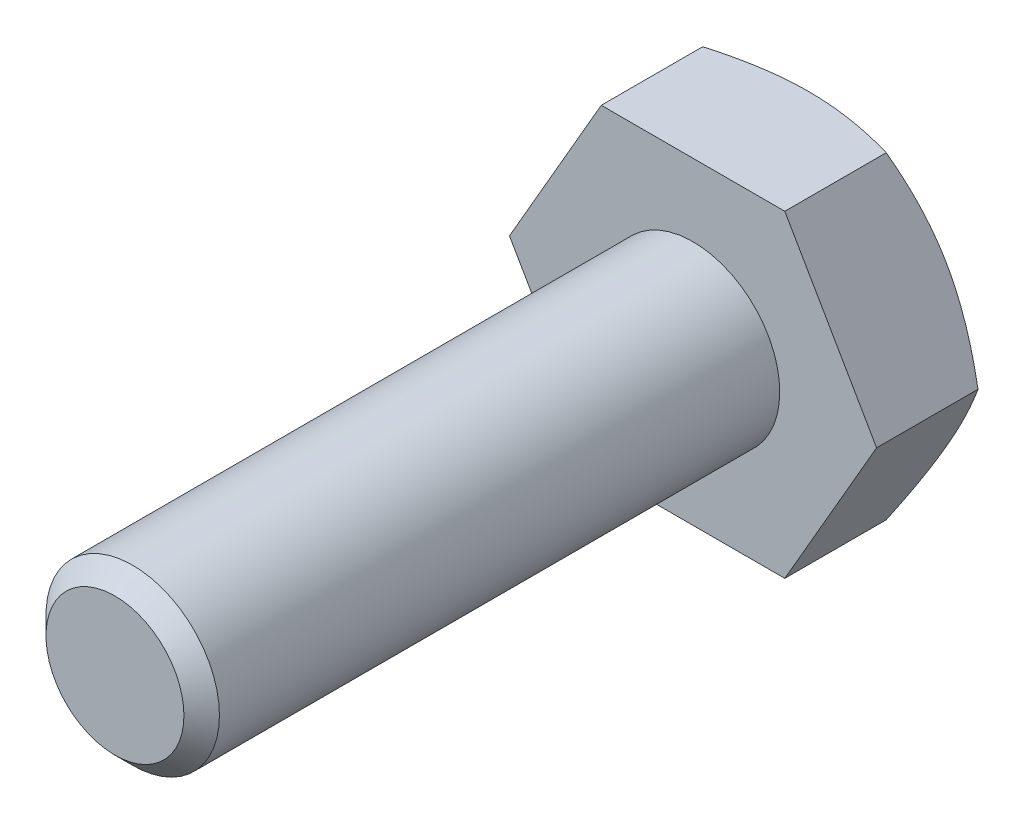
ISO-10303-21;
HEADER;
FILE_DESCRIPTION(('STEP AP214'),'2;1');
FILE_NAME('part.step','',(''),(''),'','','');
FILE_SCHEMA(('AUTOMOTIVE_DESIGN { 1 0 10303 214 1 1 1 1 }'));
ENDSEC;
DATA;
#1=APPLICATION_CONTEXT('core data for automotive mechanical design processes');
#2=APPLICATION_PROTOCOL_DEFINITION('international standard','automotive_design',2000,#1);
#3=PRODUCT_CONTEXT('',#1,'mechanical');
#4=PRODUCT('Part','Part','',(#3));
#5=PRODUCT_RELATED_PRODUCT_CATEGORY('part','',(#4));
#6=PRODUCT_DEFINITION_FORMATION('','',#4);
#7=PRODUCT_DEFINITION_CONTEXT('part definition',#1,'design');
#8=PRODUCT_DEFINITION('design','',#6,#7);
#9=PRODUCT_DEFINITION_SHAPE('','',#8);
#10=(LENGTH_UNIT() NAMED_UNIT(*) SI_UNIT(.MILLI.,.METRE.));
#11=(NAMED_UNIT(*) PLANE_ANGLE_UNIT() SI_UNIT($,.RADIAN.));
#12=(NAMED_UNIT(*) SI_UNIT($,.STERADIAN.) SOLID_ANGLE_UNIT());
#13=UNCERTAINTY_MEASURE_WITH_UNIT(LENGTH_MEASURE(1.E-05),#10,'distance_accuracy_value','');
#14=(GEOMETRIC_REPRESENTATION_CONTEXT(3) GLOBAL_UNCERTAINTY_ASSIGNED_CONTEXT((#13)) GLOBAL_UNIT_ASSIGNED_CONTEXT((#10,
#11,#12)) REPRESENTATION_CONTEXT('',''));
#15=CARTESIAN_POINT('',(0.,0.,0.));
#16=DIRECTION('',(0.,0.,1.));
#17=DIRECTION('',(1.,0.,0.));
#18=AXIS2_PLACEMENT_3D('',#15,#16,#17);
#19=CARTESIAN_POINT('',(1.58771324027147,-2.75,2.));
#20=DIRECTION('',(-0.866025403784439,0.5,0.));
#21=DIRECTION('',(-0.5,-0.866025403784439,0.));
#22=AXIS2_PLACEMENT_3D('',#19,#20,#21);
#23=PLANE('',#22);
#24=CARTESIAN_POINT('',(3.17554195059678,0.000200000000001707,0.245686763364756));
#25=CARTESIAN_POINT('',(3.10576962051743,-0.120649220659903,0.205387662249254));
#26=CARTESIAN_POINT('',(3.03539502097908,-0.24254160262263,0.168736902597655));
#27=CARTESIAN_POINT('',(2.89342717394439,-0.488437126727888,0.104762182969802));
#28=CARTESIAN_POINT('',(2.82183140359859,-0.612444638573851,0.0774608556745041));
#29=CARTESIAN_POINT('',(2.67952717191843,-0.858922797975938,0.0349617452941237));
#30=CARTESIAN_POINT('',(2.60884060771578,-0.981355518587411,0.0194811186224597));
#31=CARTESIAN_POINT('',(2.46713482015519,-1.22679714236891,0.000999397369939557));
#32=CARTESIAN_POINT('',(2.39611611197038,-1.3498051532329,-0.00201700053739912));
#33=CARTESIAN_POINT('',(2.26341005486545,-1.57965878661078,0.00425314542854933));
#34=CARTESIAN_POINT('',(2.20170285541369,-1.68653879125401,0.0120001542767048));
#35=CARTESIAN_POINT('',(2.07869048467395,-1.89960246733474,0.0365551810643593));
#36=CARTESIAN_POINT('',(2.01738573896434,-2.00578540164888,0.053371589650577));
#37=CARTESIAN_POINT('',(1.89411967378235,-2.21928848939318,0.0954119223459613));
#38=CARTESIAN_POINT('',(1.83217395817123,-2.32658161614285,0.120814080687232));
#39=CARTESIAN_POINT('',(1.70920651275308,-2.53956747928405,0.178467225839978));
#40=CARTESIAN_POINT('',(1.64818320715446,-2.64526294502665,0.210704663298978));
#41=CARTESIAN_POINT('',(1.58759777021763,-2.7502,0.245686763364763));
#42=B_SPLINE_CURVE_WITH_KNOTS('',3,(#24,#25,#26,#27,#28,#29,#30,#31,#32,#33,#34,#35,#36,#37,#38,
#39,#40,#41),.UNSPECIFIED.,.F.,.F.,(4,2,2,2,2,2,2,2,4),(0.,0.435912828725885,0.872873557116326,
1.29901931904671,1.72464171213572,2.09526089052937,2.46622354066374,2.84541551798557,
3.22386274754524),.UNSPECIFIED.);
#43=CARTESIAN_POINT('',(3.17542648054293,0.,0.245620093061856));
#44=VERTEX_POINT('',#43);
#45=CARTESIAN_POINT('',(2.38156986040721,-1.375,0.));
#46=VERTEX_POINT('',#45);
#47=EDGE_CURVE('E128',#44,#46,#42,.T.);
#48=ORIENTED_EDGE('',*,*,#47,.F.);
#49=DIRECTION('',(0.,0.,-1.));
#50=VECTOR('',#49,1.);
#51=CARTESIAN_POINT('',(3.17542648054294,0.,2.));
#52=LINE('',#51,#50);
#53=CARTESIAN_POINT('',(3.17542648054294,0.,2.));
#54=VERTEX_POINT('',#53);
#55=EDGE_CURVE('E132',#54,#44,#52,.T.);
#56=ORIENTED_EDGE('',*,*,#55,.F.);
#57=DIRECTION('',(0.5,0.866025403784438,0.));
#58=VECTOR('',#57,1.);
#59=CARTESIAN_POINT('',(1.58771324027147,-2.75,2.));
#60=LINE('',#59,#58);
#61=CARTESIAN_POINT('',(1.58771324027147,-2.75,2.));
#62=VERTEX_POINT('',#61);
#63=EDGE_CURVE('E246',#62,#54,#60,.T.);
#64=ORIENTED_EDGE('',*,*,#63,.F.);
#65=DIRECTION('',(0.,0.,-1.));
#66=VECTOR('',#65,1.);
#67=CARTESIAN_POINT('',(1.58771324027147,-2.75,2.));
#68=LINE('',#67,#66);
#69=CARTESIAN_POINT('',(1.58771324027145,-2.75,0.245620093061854));
#70=VERTEX_POINT('',#69);
#71=EDGE_CURVE('E222',#62,#70,#68,.T.);
#72=ORIENTED_EDGE('',*,*,#71,.T.);
#73=EDGE_CURVE('E185',#46,#70,#42,.T.);
#74=ORIENTED_EDGE('',*,*,#73,.F.);
#75=EDGE_LOOP('',(#48,#56,#64,#72,#74));
#76=FACE_BOUND('',#75,.T.);
#77=ADVANCED_FACE('F36',(#76),#23,.F.);
#78=CARTESIAN_POINT('',(3.17542648054294,0.,2.));
#79=DIRECTION('',(-0.866025403784438,-0.5,0.));
#80=DIRECTION('',(0.5,-0.866025403784438,0.));
#81=AXIS2_PLACEMENT_3D('',#78,#79,#80);
#82=PLANE('',#81);
#83=CARTESIAN_POINT('',(1.58759777021763,2.7502,0.245686763364752));
#84=CARTESIAN_POINT('',(1.65737010029698,2.6293507793401,0.205387662249252));
#85=CARTESIAN_POINT('',(1.72774469983533,2.50745839737737,0.168736902597655));
#86=CARTESIAN_POINT('',(1.86971254687002,2.26156287327211,0.104762182969804));
#87=CARTESIAN_POINT('',(1.94130831721583,2.13755536142615,0.0774608556745066));
#88=CARTESIAN_POINT('',(2.08361254889599,1.89107720202406,0.0349617452941277));
#89=CARTESIAN_POINT('',(2.15429911309864,1.76864448141259,0.0194811186224644));
#90=CARTESIAN_POINT('',(2.29600490065922,1.52320285763109,0.000999397369945049));
#91=CARTESIAN_POINT('',(2.36702360884403,1.40019484676709,-0.00201700053739336));
#92=CARTESIAN_POINT('',(2.49972966594897,1.17034121338921,0.00425314542855519));
#93=CARTESIAN_POINT('',(2.56143686540072,1.06346120874598,0.0120001542767105));
#94=CARTESIAN_POINT('',(2.68444923614046,0.850397532665255,0.0365551810643646));
#95=CARTESIAN_POINT('',(2.74575398185008,0.744214598351115,0.0533715896505821));
#96=CARTESIAN_POINT('',(2.86902004703206,0.530711510606819,0.0954119223459655));
#97=CARTESIAN_POINT('',(2.93096576264318,0.423418383857147,0.120814080687235));
#98=CARTESIAN_POINT('',(3.05393320806134,0.210432520715949,0.17846722583998));
#99=CARTESIAN_POINT('',(3.11495651365995,0.104737054973347,0.210704663298979));
#100=CARTESIAN_POINT('',(3.17554195059678,-0.000199999999999859,0.245686763364762));
#101=B_SPLINE_CURVE_WITH_KNOTS('',3,(#83,#84,#85,#86,#87,#88,#89,#90,#91,#92,#93,#94,#95,#96,
#97,#98,#99,#100),.UNSPECIFIED.,.F.,.F.,(4,2,2,2,2,2,2,2,4),(0.,0.435912828725885,
0.872873557116326,1.29901931904671,1.72464171213573,2.09526089052937,2.46622354066374,
2.84541551798557,3.22386274754524),.UNSPECIFIED.);
#102=CARTESIAN_POINT('',(1.58771324027148,2.74999999999998,0.245620093061853));
#103=VERTEX_POINT('',#102);
#104=CARTESIAN_POINT('',(2.38156986040721,1.375,0.));
#105=VERTEX_POINT('',#104);
#106=EDGE_CURVE('E107',#103,#105,#101,.T.);
#107=ORIENTED_EDGE('',*,*,#106,.F.);
#108=DIRECTION('',(0.,0.,-1.));
#109=VECTOR('',#108,1.);
#110=CARTESIAN_POINT('',(1.58771324027147,2.75,2.));
#111=LINE('',#110,#109);
#112=CARTESIAN_POINT('',(1.58771324027147,2.75,2.));
#113=VERTEX_POINT('',#112);
#114=EDGE_CURVE('E231',#113,#103,#111,.T.);
#115=ORIENTED_EDGE('',*,*,#114,.F.);
#116=DIRECTION('',(-0.5,0.866025403784438,0.));
#117=VECTOR('',#116,1.);
#118=CARTESIAN_POINT('',(3.17542648054294,0.,2.));
#119=LINE('',#118,#117);
#120=EDGE_CURVE('E250',#54,#113,#119,.T.);
#121=ORIENTED_EDGE('',*,*,#120,.F.);
#122=ORIENTED_EDGE('',*,*,#55,.T.);
#123=EDGE_CURVE('E120',#105,#44,#101,.T.);
#124=ORIENTED_EDGE('',*,*,#123,.F.);
#125=EDGE_LOOP('',(#107,#115,#121,#122,#124));
#126=FACE_BOUND('',#125,.T.);
#127=ADVANCED_FACE('F140',(#126),#82,.F.);
#128=CARTESIAN_POINT('',(1.58771324027147,2.75,2.));
#129=DIRECTION('',(0.,-1.,0.));
#130=DIRECTION('',(0.,0.,-1.));
#131=AXIS2_PLACEMENT_3D('',#128,#129,#130);
#132=PLANE('',#131);
#133=CARTESIAN_POINT('',(-4.31638594918232,2.75,1.36715210704405));
#134=CARTESIAN_POINT('',(-4.19581737051592,2.75,1.30845994096474));
#135=CARTESIAN_POINT('',(-4.07497746694739,2.75,1.25031586425216));
#136=CARTESIAN_POINT('',(-3.83261088383623,2.75,1.13543119741228));
#137=CARTESIAN_POINT('',(-3.71108410410335,2.75,1.07869081888196));
#138=CARTESIAN_POINT('',(-3.46659808789897,2.75,0.966646426591317));
#139=CARTESIAN_POINT('',(-3.34363468385964,2.75,0.911351476138761));
#140=CARTESIAN_POINT('',(-3.09674757673776,2.75,0.802956993957643));
#141=CARTESIAN_POINT('',(-2.972823917902,2.75,0.749857361778766));
#142=CARTESIAN_POINT('',(-2.71965806564943,2.75,0.644703117588246));
#143=CARTESIAN_POINT('',(-2.59037652858395,2.75,0.592742724367116));
#144=CARTESIAN_POINT('',(-2.33032018429188,2.75,0.492631038352346));
#145=CARTESIAN_POINT('',(-2.19954521421087,2.75,0.444480165603219));
#146=CARTESIAN_POINT('',(-1.9365223444922,2.75,0.353213656190183));
#147=CARTESIAN_POINT('',(-1.80427786301001,2.75,0.310088265151207));
#148=CARTESIAN_POINT('',(-1.53789259482414,2.75,0.230222209632179));
#149=CARTESIAN_POINT('',(-1.40375240288282,2.75,0.193479588678769));
#150=CARTESIAN_POINT('',(-1.13423793476322,2.75,0.128302067791659));
#151=CARTESIAN_POINT('',(-0.998874970875652,2.75,0.0998212369444805));
#152=CARTESIAN_POINT('',(-0.726413092453885,2.75,0.0527456161691723));
#153=CARTESIAN_POINT('',(-0.589314364619276,2.75,0.0341497721022308));
#154=CARTESIAN_POINT('',(-0.315877662564309,2.75,0.00856858652498791));
#155=CARTESIAN_POINT('',(-0.179554395289457,2.75,0.0014299267905237));
#156=CARTESIAN_POINT('',(0.0932131339370565,2.75,-0.00103867463557896));
#157=CARTESIAN_POINT('',(0.229657397936016,2.75,0.00363158744684535));
#158=CARTESIAN_POINT('',(0.459764674388275,2.75,0.0211304631968855));
#159=CARTESIAN_POINT('',(0.553667213671686,2.75,0.0310050171194729));
#160=CARTESIAN_POINT('',(0.740814471055632,2.75,0.055760139531657));
#161=CARTESIAN_POINT('',(0.834059104056982,2.75,0.0706413439292701));
#162=CARTESIAN_POINT('',(1.11266283109748,2.75,0.122015798898182));
#163=CARTESIAN_POINT('',(1.29679769159134,2.75,0.165231761163537));
#164=CARTESIAN_POINT('',(1.57226006867404,2.75,0.240559912331172));
#165=CARTESIAN_POINT('',(1.66500394654352,2.75,0.267790894506829));
#166=CARTESIAN_POINT('',(1.84959145582332,2.75,0.325176661417261));
#167=CARTESIAN_POINT('',(1.9414350804195,2.75,0.355331468264057));
#168=CARTESIAN_POINT('',(2.12425036464145,2.75,0.418073021824297));
#169=CARTESIAN_POINT('',(2.21522226940173,2.75,0.450659060772911));
#170=CARTESIAN_POINT('',(2.3964050130485,2.75,0.517870145035879));
#171=CARTESIAN_POINT('',(2.48661586829762,2.75,0.552495146383974));
#172=CARTESIAN_POINT('',(2.72631941369534,2.75,0.647111868128739));
#173=CARTESIAN_POINT('',(2.87521406734214,2.75,0.708617133437105));
#174=CARTESIAN_POINT('',(3.17149877963133,2.75,0.835163108096415));
#175=CARTESIAN_POINT('',(3.31888867900127,2.75,0.900204187184521));
#176=CARTESIAN_POINT('',(3.612498606976,2.75,1.0329937298421));
#177=CARTESIAN_POINT('',(3.7587182324204,2.75,1.10074308197789));
#178=CARTESIAN_POINT('',(4.05017738563283,2.75,1.23832197569377));
#179=CARTESIAN_POINT('',(4.1954168842448,2.75,1.3081515788239));
#180=CARTESIAN_POINT('',(4.63039070223179,2.75,1.52027220806308));
#181=CARTESIAN_POINT('',(4.91893915080495,2.75,1.66499194206909));
#182=CARTESIAN_POINT('',(5.49386340867002,2.75,1.95851426505822));
#183=CARTESIAN_POINT('',(5.78023963786972,2.75,2.1073160378755));
#184=CARTESIAN_POINT('',(6.32194576487132,2.75,2.39216757225533));
#185=CARTESIAN_POINT('',(6.57742037004848,2.75,2.52794261914921));
#186=CARTESIAN_POINT('',(7.08750371442345,2.75,2.80114245272759));
#187=CARTESIAN_POINT('',(7.34211240206399,2.75,2.93856733551162));
#188=CARTESIAN_POINT('',(7.84983547824256,2.75,3.21419429818602));
#189=CARTESIAN_POINT('',(8.10295203313654,2.75,3.35239239225699));
#190=CARTESIAN_POINT('',(8.60864374493556,2.75,3.62973059253265));
#191=CARTESIAN_POINT('',(8.86121894150219,2.75,3.76887062638957));
#192=CARTESIAN_POINT('',(9.11360311770114,2.75,3.90835389259637));
#193=B_SPLINE_CURVE_WITH_KNOTS('',3,(#133,#134,#135,#136,#137,#138,#139,#140,#141,#142,#143,
#144,#145,#146,#147,#148,#149,#150,#151,#152,#153,#154,#155,#156,#157,#158,#159,#160,#161,#162,
#163,#164,#165,#166,#167,#168,#169,#170,#171,#172,#173,#174,#175,#176,#177,#178,#179,#180,#181,
#182,#183,#184,#185,#186,#187,#188,#189,#190,#191,#192),.UNSPECIFIED.,.F.,.F.,(4,2,2,2,2,2,2,2,
2,2,2,2,2,2,2,2,2,2,2,2,2,2,2,2,2,2,2,2,2,4),(0.,0.402290608258888,0.80464149378454,
1.20909649725655,1.61353297371178,2.03148461048144,2.44948226730263,2.86665458560833,
3.28369880400756,3.69837799217314,4.1130129499138,4.52205162226931,4.93109735302036,
5.21422195546482,5.49738253190362,6.06398562819829,6.35393648052208,6.64388952582945,
6.93375848874895,7.22362120349515,7.70684704660544,8.19012351781079,8.67355987154431,
9.15701054332948,10.1253686031769,11.0935344400116,11.9614658313278,12.8294480255312,
13.6946049258819,14.5596961132789),.UNSPECIFIED.);
#194=CARTESIAN_POINT('',(-1.58771324027148,2.74999999999998,0.245620093061856));
#195=VERTEX_POINT('',#194);
#196=CARTESIAN_POINT('',(0.,2.75,0.));
#197=VERTEX_POINT('',#196);
#198=EDGE_CURVE('E51',#195,#197,#193,.T.);
#199=ORIENTED_EDGE('',*,*,#198,.F.);
#200=DIRECTION('',(0.,0.,-1.));
#201=VECTOR('',#200,1.);
#202=CARTESIAN_POINT('',(-1.58771324027147,2.75,2.));
#203=LINE('',#202,#201);
#204=CARTESIAN_POINT('',(-1.58771324027147,2.75,2.));
#205=VERTEX_POINT('',#204);
#206=EDGE_CURVE('E224',#205,#195,#203,.T.);
#207=ORIENTED_EDGE('',*,*,#206,.F.);
#208=DIRECTION('',(-1.,0.,0.));
#209=VECTOR('',#208,1.);
#210=CARTESIAN_POINT('',(1.58771324027147,2.75,2.));
#211=LINE('',#210,#209);
#212=EDGE_CURVE('E254',#113,#205,#211,.T.);
#213=ORIENTED_EDGE('',*,*,#212,.F.);
#214=ORIENTED_EDGE('',*,*,#114,.T.);
#215=EDGE_CURVE('E114',#197,#103,#193,.T.);
#216=ORIENTED_EDGE('',*,*,#215,.F.);
#217=EDGE_LOOP('',(#199,#207,#213,#214,#216));
#218=FACE_BOUND('',#217,.T.);
#219=ADVANCED_FACE('F195',(#218),#132,.F.);
#220=CARTESIAN_POINT('',(-1.58771324027147,2.75,2.));
#221=DIRECTION('',(0.866025403784439,-0.5,0.));
#222=DIRECTION('',(0.5,0.866025403784439,0.));
#223=AXIS2_PLACEMENT_3D('',#220,#221,#222);
#224=PLANE('',#223);
#225=CARTESIAN_POINT('',(-3.17554195059678,-0.000200000000001425,0.245686763364756));
#226=CARTESIAN_POINT('',(-3.10576962051743,0.120649220659901,0.205387662249244));
#227=CARTESIAN_POINT('',(-3.03539502097908,0.242541602622629,0.168736902597647));
#228=CARTESIAN_POINT('',(-2.89342717394439,0.488437126727888,0.104762182969802));
#229=CARTESIAN_POINT('',(-2.82183140359859,0.612444638573852,0.0774608556745108));
#230=CARTESIAN_POINT('',(-2.67952717191843,0.85892279797594,0.0349617452941296));
#231=CARTESIAN_POINT('',(-2.60884060771578,0.981355518587412,0.0194811186224586));
#232=CARTESIAN_POINT('',(-2.46713482015519,1.22679714236891,0.000999397369939867));
#233=CARTESIAN_POINT('',(-2.39611611197038,1.3498051532329,-0.00201700053739041));
#234=CARTESIAN_POINT('',(-2.26341005486545,1.57965878661079,0.00425314542855696));
#235=CARTESIAN_POINT('',(-2.20170285541369,1.68653879125402,0.0120001542767051));
#236=CARTESIAN_POINT('',(-2.07869048467395,1.89960246733474,0.0365551810643579));
#237=CARTESIAN_POINT('',(-2.01738573896434,2.00578540164888,0.0533715896505813));
#238=CARTESIAN_POINT('',(-1.89411967378235,2.21928848939318,0.0954119223459695));
#239=CARTESIAN_POINT('',(-1.83217395817123,2.32658161614285,0.120814080687238));
#240=CARTESIAN_POINT('',(-1.70920651275308,2.53956747928405,0.17846722583998));
#241=CARTESIAN_POINT('',(-1.64818320715446,2.64526294502665,0.210704663298978));
#242=CARTESIAN_POINT('',(-1.58759777021763,2.7502,0.245686763364763));
#243=B_SPLINE_CURVE_WITH_KNOTS('',3,(#225,#226,#227,#228,#229,#230,#231,#232,#233,#234,#235,
#236,#237,#238,#239,#240,#241,#242),.UNSPECIFIED.,.F.,.F.,(4,2,2,2,2,2,2,2,4),(0.,
0.435912828725885,0.872873557116327,1.29901931904671,1.72464171213573,2.09526089052937,
2.46622354066374,2.84541551798557,3.22386274754524),.UNSPECIFIED.);
#244=CARTESIAN_POINT('',(-3.17542648054293,0.,0.245620093061855));
#245=VERTEX_POINT('',#244);
#246=CARTESIAN_POINT('',(-2.38156986040721,1.375,0.));
#247=VERTEX_POINT('',#246);
#248=EDGE_CURVE('E59',#245,#247,#243,.T.);
#249=ORIENTED_EDGE('',*,*,#248,.F.);
#250=DIRECTION('',(0.,0.,-1.));
#251=VECTOR('',#250,1.);
#252=CARTESIAN_POINT('',(-3.17542648054294,0.,2.));
#253=LINE('',#252,#251);
#254=CARTESIAN_POINT('',(-3.17542648054294,0.,2.));
#255=VERTEX_POINT('',#254);
#256=EDGE_CURVE('E221',#255,#245,#253,.T.);
#257=ORIENTED_EDGE('',*,*,#256,.F.);
#258=DIRECTION('',(-0.5,-0.866025403784438,0.));
#259=VECTOR('',#258,1.);
#260=CARTESIAN_POINT('',(-1.58771324027147,2.75,2.));
#261=LINE('',#260,#259);
#262=EDGE_CURVE('E256',#205,#255,#261,.T.);
#263=ORIENTED_EDGE('',*,*,#262,.F.);
#264=ORIENTED_EDGE('',*,*,#206,.T.);
#265=EDGE_CURVE('E119',#247,#195,#243,.T.);
#266=ORIENTED_EDGE('',*,*,#265,.F.);
#267=EDGE_LOOP('',(#249,#257,#263,#264,#266));
#268=FACE_BOUND('',#267,.T.);
#269=ADVANCED_FACE('F240',(#268),#224,.F.);
#270=CARTESIAN_POINT('',(-3.17542648054294,0.,2.));
#271=DIRECTION('',(0.866025403784438,0.5,0.));
#272=DIRECTION('',(-0.5,0.866025403784438,0.));
#273=AXIS2_PLACEMENT_3D('',#270,#271,#272);
#274=PLANE('',#273);
#275=CARTESIAN_POINT('',(-1.58759777021763,-2.7502,0.245686763364752));
#276=CARTESIAN_POINT('',(-1.65737010029698,-2.6293507793401,0.205387662249251));
#277=CARTESIAN_POINT('',(-1.72774469983533,-2.50745839737737,0.168736902597654));
#278=CARTESIAN_POINT('',(-1.86971254687003,-2.26156287327211,0.104762182969803));
#279=CARTESIAN_POINT('',(-1.94130831721583,-2.13755536142615,0.0774608556745064));
#280=CARTESIAN_POINT('',(-2.08361254889599,-1.89107720202406,0.0349617452941278));
#281=CARTESIAN_POINT('',(-2.15429911309864,-1.76864448141259,0.0194811186224644));
#282=CARTESIAN_POINT('',(-2.29600490065922,-1.52320285763109,0.000999397369945159));
#283=CARTESIAN_POINT('',(-2.36702360884403,-1.40019484676709,-0.00201700053739319));
#284=CARTESIAN_POINT('',(-2.49972966594897,-1.17034121338921,0.00425314542855519));
#285=CARTESIAN_POINT('',(-2.56143686540072,-1.06346120874598,0.0120001542767104));
#286=CARTESIAN_POINT('',(-2.68444923614046,-0.850397532665254,0.0365551810643644));
#287=CARTESIAN_POINT('',(-2.74575398185008,-0.744214598351115,0.053371589650582));
#288=CARTESIAN_POINT('',(-2.86902004703206,-0.530711510606819,0.0954119223459656));
#289=CARTESIAN_POINT('',(-2.93096576264318,-0.423418383857146,0.120814080687235));
#290=CARTESIAN_POINT('',(-3.05393320806134,-0.210432520715948,0.17846722583998));
#291=CARTESIAN_POINT('',(-3.11495651365995,-0.104737054973347,0.210704663298979));
#292=CARTESIAN_POINT('',(-3.17554195059678,0.000200000000000259,0.245686763364762));
#293=B_SPLINE_CURVE_WITH_KNOTS('',3,(#275,#276,#277,#278,#279,#280,#281,#282,#283,#284,#285,
#286,#287,#288,#289,#290,#291,#292),.UNSPECIFIED.,.F.,.F.,(4,2,2,2,2,2,2,2,4),(0.,
0.435912828725885,0.872873557116326,1.29901931904671,1.72464171213573,2.09526089052937,
2.46622354066374,2.84541551798557,3.22386274754524),.UNSPECIFIED.);
#294=CARTESIAN_POINT('',(-1.58771324027162,-2.75,0.245620093061744));
#295=VERTEX_POINT('',#294);
#296=CARTESIAN_POINT('',(-2.38156986040721,-1.375,0.));
#297=VERTEX_POINT('',#296);
#298=EDGE_CURVE('E179',#295,#297,#293,.T.);
#299=ORIENTED_EDGE('',*,*,#298,.F.);
#300=DIRECTION('',(0.,0.,-1.));
#301=VECTOR('',#300,1.);
#302=CARTESIAN_POINT('',(-1.58771324027147,-2.75,2.));
#303=LINE('',#302,#301);
#304=CARTESIAN_POINT('',(-1.58771324027147,-2.75,2.));
#305=VERTEX_POINT('',#304);
#306=EDGE_CURVE('E215',#305,#295,#303,.T.);
#307=ORIENTED_EDGE('',*,*,#306,.F.);
#308=DIRECTION('',(0.5,-0.866025403784438,0.));
#309=VECTOR('',#308,1.);
#310=CARTESIAN_POINT('',(-3.17542648054294,0.,2.));
#311=LINE('',#310,#309);
#312=EDGE_CURVE('E258',#255,#305,#311,.T.);
#313=ORIENTED_EDGE('',*,*,#312,.F.);
#314=ORIENTED_EDGE('',*,*,#256,.T.);
#315=EDGE_CURVE('E142',#297,#245,#293,.T.);
#316=ORIENTED_EDGE('',*,*,#315,.F.);
#317=EDGE_LOOP('',(#299,#307,#313,#314,#316));
#318=FACE_BOUND('',#317,.T.);
#319=ADVANCED_FACE('F213',(#318),#274,.F.);
#320=CARTESIAN_POINT('',(-1.58771324027147,-2.75,2.));
#321=DIRECTION('',(0.,1.,0.));
#322=DIRECTION('',(-1.,0.,0.));
#323=AXIS2_PLACEMENT_3D('',#320,#321,#322);
#324=PLANE('',#323);
#325=CARTESIAN_POINT('',(-4.31638594918231,-2.75,1.36715210704405));
#326=CARTESIAN_POINT('',(-4.19581737051592,-2.75,1.30845994096474));
#327=CARTESIAN_POINT('',(-4.07497746694739,-2.75,1.25031586425216));
#328=CARTESIAN_POINT('',(-3.83261088383623,-2.75,1.13543119741228));
#329=CARTESIAN_POINT('',(-3.71108410410335,-2.75,1.07869081888196));
#330=CARTESIAN_POINT('',(-3.46659808789897,-2.75,0.966646426591317));
#331=CARTESIAN_POINT('',(-3.34363468385964,-2.75,0.911351476138761));
#332=CARTESIAN_POINT('',(-3.09674757673776,-2.75,0.802956993957643));
#333=CARTESIAN_POINT('',(-2.972823917902,-2.75,0.749857361778766));
#334=CARTESIAN_POINT('',(-2.71965806564943,-2.75,0.644703117588245));
#335=CARTESIAN_POINT('',(-2.59037652858395,-2.75,0.592742724367116));
#336=CARTESIAN_POINT('',(-2.33032018429188,-2.75,0.492631038352346));
#337=CARTESIAN_POINT('',(-2.19954521421087,-2.75,0.444480165603219));
#338=CARTESIAN_POINT('',(-1.9365223444922,-2.75,0.353213656190183));
#339=CARTESIAN_POINT('',(-1.80427786301001,-2.75,0.310088265151207));
#340=CARTESIAN_POINT('',(-1.53789259482414,-2.75,0.230222209632179));
#341=CARTESIAN_POINT('',(-1.40375240288282,-2.75,0.193479588678769));
#342=CARTESIAN_POINT('',(-1.13423793476322,-2.75,0.128302067791659));
#343=CARTESIAN_POINT('',(-0.998874970875651,-2.75,0.0998212369444806));
#344=CARTESIAN_POINT('',(-0.726413092453884,-2.75,0.0527456161691724));
#345=CARTESIAN_POINT('',(-0.589314364619276,-2.75,0.0341497721022307));
#346=CARTESIAN_POINT('',(-0.315877662564308,-2.75,0.00856858652498762));
#347=CARTESIAN_POINT('',(-0.179554395289456,-2.75,0.00142992679052341));
#348=CARTESIAN_POINT('',(0.0932131339370574,-2.75,-0.00103867463557906));
#349=CARTESIAN_POINT('',(0.229657397936017,-2.75,0.00363158744684545));
#350=CARTESIAN_POINT('',(0.459764674388276,-2.75,0.0211304631968855));
#351=CARTESIAN_POINT('',(0.553667213671687,-2.75,0.0310050171194728));
#352=CARTESIAN_POINT('',(0.740814471055633,-2.75,0.0557601395316572));
#353=CARTESIAN_POINT('',(0.834059104056983,-2.75,0.0706413439292707));
#354=CARTESIAN_POINT('',(1.11266283109748,-2.75,0.122015798898182));
#355=CARTESIAN_POINT('',(1.29679769159134,-2.75,0.165231761163532));
#356=CARTESIAN_POINT('',(1.57226006867404,-2.75,0.240559912331175));
#357=CARTESIAN_POINT('',(1.66500394654352,-2.75,0.267790894506837));
#358=CARTESIAN_POINT('',(1.84959145582332,-2.75,0.325176661417269));
#359=CARTESIAN_POINT('',(1.9414350804195,-2.75,0.35533146826406));
#360=CARTESIAN_POINT('',(2.12425036464146,-2.75,0.418073021824296));
#361=CARTESIAN_POINT('',(2.21522226940173,-2.75,0.450659060772911));
#362=CARTESIAN_POINT('',(2.3964050130485,-2.75,0.51787014503588));
#363=CARTESIAN_POINT('',(2.48661586829762,-2.75,0.552495146383975));
#364=CARTESIAN_POINT('',(2.72631941369534,-2.75,0.64711186812874));
#365=CARTESIAN_POINT('',(2.87521406734214,-2.75,0.708617133437106));
#366=CARTESIAN_POINT('',(3.17149877963133,-2.75,0.835163108096417));
#367=CARTESIAN_POINT('',(3.31888867900127,-2.75,0.900204187184522));
#368=CARTESIAN_POINT('',(3.612498606976,-2.75,1.0329937298421));
#369=CARTESIAN_POINT('',(3.7587182324204,-2.75,1.10074308197789));
#370=CARTESIAN_POINT('',(4.05017738563283,-2.75,1.23832197569377));
#371=CARTESIAN_POINT('',(4.19541688424481,-2.75,1.3081515788239));
#372=CARTESIAN_POINT('',(4.63039070223179,-2.75,1.52027220806308));
#373=CARTESIAN_POINT('',(4.91893915080495,-2.75,1.6649919420691));
#374=CARTESIAN_POINT('',(5.49386340867001,-2.75,1.95851426505822));
#375=CARTESIAN_POINT('',(5.78023963786972,-2.75,2.1073160378755));
#376=CARTESIAN_POINT('',(6.32194576487132,-2.75,2.39216757225532));
#377=CARTESIAN_POINT('',(6.57742037004848,-2.75,2.5279426191492));
#378=CARTESIAN_POINT('',(7.08750371442345,-2.75,2.80114245272759));
#379=CARTESIAN_POINT('',(7.34211240206399,-2.75,2.93856733551163));
#380=CARTESIAN_POINT('',(7.84983547824256,-2.75,3.21419429818602));
#381=CARTESIAN_POINT('',(8.10295203313654,-2.75,3.35239239225698));
#382=CARTESIAN_POINT('',(8.60864374493556,-2.75,3.62973059253264));
#383=CARTESIAN_POINT('',(8.8612189415022,-2.75,3.76887062638956));
#384=CARTESIAN_POINT('',(9.11360311770115,-2.75,3.90835389259637));
#385=B_SPLINE_CURVE_WITH_KNOTS('',3,(#325,#326,#327,#328,#329,#330,#331,#332,#333,#334,#335,
#336,#337,#338,#339,#340,#341,#342,#343,#344,#345,#346,#347,#348,#349,#350,#351,#352,#353,#354,
#355,#356,#357,#358,#359,#360,#361,#362,#363,#364,#365,#366,#367,#368,#369,#370,#371,#372,#373,
#374,#375,#376,#377,#378,#379,#380,#381,#382,#383,#384),.UNSPECIFIED.,.F.,.F.,(4,2,2,2,2,2,2,2,
2,2,2,2,2,2,2,2,2,2,2,2,2,2,2,2,2,2,2,2,2,4),(0.,0.402290608258888,0.80464149378454,
1.20909649725655,1.61353297371178,2.03148461048144,2.44948226730263,2.86665458560833,
3.28369880400756,3.69837799217314,4.1130129499138,4.52205162226931,4.93109735302036,
5.21422195546482,5.49738253190362,6.06398562819829,6.35393648052208,6.64388952582945,
6.93375848874895,7.22362120349515,7.70684704660544,8.19012351781079,8.67355987154431,
9.15701054332948,10.1253686031769,11.0935344400116,11.9614658313277,12.8294480255312,
13.6946049258819,14.5596961132789),.UNSPECIFIED.);
#386=CARTESIAN_POINT('',(0.,-2.75,0.));
#387=VERTEX_POINT('',#386);
#388=EDGE_CURVE('E199',#70,#387,#385,.F.);
#389=ORIENTED_EDGE('',*,*,#388,.F.);
#390=ORIENTED_EDGE('',*,*,#71,.F.);
#391=DIRECTION('',(1.,0.,0.));
#392=VECTOR('',#391,1.);
#393=CARTESIAN_POINT('',(-1.58771324027147,-2.75,2.));
#394=LINE('',#393,#392);
#395=EDGE_CURVE('E220',#305,#62,#394,.T.);
#396=ORIENTED_EDGE('',*,*,#395,.F.);
#397=ORIENTED_EDGE('',*,*,#306,.T.);
#398=EDGE_CURVE('E137',#387,#295,#385,.F.);
#399=ORIENTED_EDGE('',*,*,#398,.F.);
#400=EDGE_LOOP('',(#389,#390,#396,#397,#399));
#401=FACE_BOUND('',#400,.T.);
#402=ADVANCED_FACE('F218',(#401),#324,.F.);
#403=CARTESIAN_POINT('',(3.17542648054294,0.,2.));
#404=DIRECTION('',(0.,0.,1.));
#405=DIRECTION('',(1.,0.,0.));
#406=AXIS2_PLACEMENT_3D('',#403,#404,#405);
#407=PLANE('',#406);
#408=ORIENTED_EDGE('',*,*,#63,.T.);
#409=ORIENTED_EDGE('',*,*,#120,.T.);
#410=ORIENTED_EDGE('',*,*,#212,.T.);
#411=ORIENTED_EDGE('',*,*,#262,.T.);
#412=ORIENTED_EDGE('',*,*,#312,.T.);
#413=ORIENTED_EDGE('',*,*,#395,.T.);
#414=EDGE_LOOP('',(#408,#409,#410,#411,#412,#413));
#415=FACE_BOUND('',#414,.T.);
#416=CARTESIAN_POINT('',(0.,0.,2.));
#417=DIRECTION('',(0.,0.,1.));
#418=DIRECTION('',(1.,0.,0.));
#419=AXIS2_PLACEMENT_3D('',#416,#417,#418);
#420=CIRCLE('',#419,1.5);
#421=CARTESIAN_POINT('',(1.5,0.,2.));
#422=VERTEX_POINT('',#421);
#423=EDGE_CURVE('E244',#422,#422,#420,.T.);
#424=ORIENTED_EDGE('',*,*,#423,.F.);
#425=EDGE_LOOP('',(#424));
#426=FACE_BOUND('',#425,.T.);
#427=ADVANCED_FACE('F260',(#415,#426),#407,.T.);
#428=CARTESIAN_POINT('',(0.,0.,12.));
#429=DIRECTION('',(0.,0.,-1.));
#430=DIRECTION('',(-1.,0.,0.));
#431=AXIS2_PLACEMENT_3D('',#428,#429,#430);
#432=CYLINDRICAL_SURFACE('',#431,1.5);
#433=CARTESIAN_POINT('',(0.,0.,11.693));
#434=DIRECTION('',(0.,0.,1.));
#435=DIRECTION('',(1.,0.,0.));
#436=AXIS2_PLACEMENT_3D('',#433,#434,#435);
#437=CIRCLE('',#436,1.5);
#438=CARTESIAN_POINT('',(1.5,0.,11.693));
#439=VERTEX_POINT('',#438);
#440=EDGE_CURVE('E11',#439,#439,#437,.F.);
#441=ORIENTED_EDGE('',*,*,#440,.T.);
#442=EDGE_LOOP('',(#441));
#443=FACE_BOUND('',#442,.T.);
#444=ORIENTED_EDGE('',*,*,#423,.T.);
#445=EDGE_LOOP('',(#444));
#446=FACE_BOUND('',#445,.T.);
#447=ADVANCED_FACE('F278',(#443,#446),#432,.T.);
#448=CARTESIAN_POINT('',(0.,0.,12.));
#449=DIRECTION('',(0.,0.,1.));
#450=DIRECTION('',(1.,0.,0.));
#451=AXIS2_PLACEMENT_3D('',#448,#449,#450);
#452=PLANE('',#451);
#453=CARTESIAN_POINT('',(0.,0.,12.));
#454=DIRECTION('',(0.,0.,1.));
#455=DIRECTION('',(1.,0.,0.));
#456=AXIS2_PLACEMENT_3D('',#453,#454,#455);
#457=CIRCLE('',#456,1.193);
#458=CARTESIAN_POINT('',(1.193,0.,12.));
#459=VERTEX_POINT('',#458);
#460=EDGE_CURVE('E44',#459,#459,#457,.T.);
#461=ORIENTED_EDGE('',*,*,#460,.T.);
#462=EDGE_LOOP('',(#461));
#463=FACE_BOUND('',#462,.T.);
#464=ADVANCED_FACE('F167',(#463),#452,.T.);
#465=CARTESIAN_POINT('',(0.,0.,57.7350269189618));
#466=DIRECTION('',(0.,0.,1.));
#467=DIRECTION('',(1.,0.,0.));
#468=AXIS2_PLACEMENT_3D('',#465,#466,#467);
#469=CONICAL_SURFACE('',#468,102.75,1.0471975511966);
#470=ORIENTED_EDGE('',*,*,#123,.T.);
#471=ORIENTED_EDGE('',*,*,#47,.T.);
#472=CARTESIAN_POINT('',(0.,0.,0.));
#473=DIRECTION('',(0.,0.,1.));
#474=DIRECTION('',(1.,0.,0.));
#475=AXIS2_PLACEMENT_3D('',#472,#473,#474);
#476=CIRCLE('',#475,2.74999999999999);
#477=EDGE_CURVE('E125',#46,#105,#476,.T.);
#478=ORIENTED_EDGE('',*,*,#477,.T.);
#479=EDGE_LOOP('',(#470,#471,#478));
#480=FACE_BOUND('',#479,.T.);
#481=ADVANCED_FACE('F126',(#480),#469,.T.);
#482=ORIENTED_EDGE('',*,*,#73,.T.);
#483=ORIENTED_EDGE('',*,*,#388,.T.);
#484=EDGE_CURVE('E131',#387,#46,#476,.T.);
#485=ORIENTED_EDGE('',*,*,#484,.T.);
#486=EDGE_LOOP('',(#482,#483,#485));
#487=FACE_BOUND('',#486,.T.);
#488=ADVANCED_FACE('F237',(#487),#469,.T.);
#489=ORIENTED_EDGE('',*,*,#298,.T.);
#490=EDGE_CURVE('E208',#297,#387,#476,.T.);
#491=ORIENTED_EDGE('',*,*,#490,.T.);
#492=ORIENTED_EDGE('',*,*,#398,.T.);
#493=EDGE_LOOP('',(#489,#491,#492));
#494=FACE_BOUND('',#493,.T.);
#495=ADVANCED_FACE('F166',(#494),#469,.T.);
#496=ORIENTED_EDGE('',*,*,#248,.T.);
#497=EDGE_CURVE('E236',#247,#297,#476,.T.);
#498=ORIENTED_EDGE('',*,*,#497,.T.);
#499=ORIENTED_EDGE('',*,*,#315,.T.);
#500=EDGE_LOOP('',(#496,#498,#499));
#501=FACE_BOUND('',#500,.T.);
#502=ADVANCED_FACE('F165',(#501),#469,.T.);
#503=ORIENTED_EDGE('',*,*,#198,.T.);
#504=EDGE_CURVE('E134',#197,#247,#476,.T.);
#505=ORIENTED_EDGE('',*,*,#504,.T.);
#506=ORIENTED_EDGE('',*,*,#265,.T.);
#507=EDGE_LOOP('',(#503,#505,#506));
#508=FACE_BOUND('',#507,.T.);
#509=ADVANCED_FACE('F161',(#508),#469,.T.);
#510=ORIENTED_EDGE('',*,*,#215,.T.);
#511=ORIENTED_EDGE('',*,*,#106,.T.);
#512=CARTESIAN_POINT('',(0.,0.,0.));
#513=DIRECTION('',(0.,0.,1.));
#514=DIRECTION('',(1.,0.,0.));
#515=AXIS2_PLACEMENT_3D('',#512,#513,#514);
#516=CIRCLE('',#515,2.75);
#517=EDGE_CURVE('E111',#105,#197,#516,.T.);
#518=ORIENTED_EDGE('',*,*,#517,.T.);
#519=EDGE_LOOP('',(#510,#511,#518));
#520=FACE_BOUND('',#519,.T.);
#521=ADVANCED_FACE('F109',(#520),#469,.T.);
#522=CARTESIAN_POINT('',(3.17542648054294,0.,0.));
#523=DIRECTION('',(0.,0.,1.));
#524=DIRECTION('',(1.,0.,0.));
#525=AXIS2_PLACEMENT_3D('',#522,#523,#524);
#526=PLANE('',#525);
#527=ORIENTED_EDGE('',*,*,#517,.F.);
#528=ORIENTED_EDGE('',*,*,#477,.F.);
#529=ORIENTED_EDGE('',*,*,#484,.F.);
#530=ORIENTED_EDGE('',*,*,#490,.F.);
#531=ORIENTED_EDGE('',*,*,#497,.F.);
#532=ORIENTED_EDGE('',*,*,#504,.F.);
#533=EDGE_LOOP('',(#527,#528,#529,#530,#531,#532));
#534=FACE_BOUND('',#533,.T.);
#535=ADVANCED_FACE('F135',(#534),#526,.F.);
#536=CARTESIAN_POINT('',(0.,0.,12.));
#537=DIRECTION('',(0.,0.,-1.));
#538=DIRECTION('',(-1.,0.,0.));
#539=AXIS2_PLACEMENT_3D('',#536,#537,#538);
#540=CONICAL_SURFACE('',#539,1.193,0.785398163397449);
#541=ORIENTED_EDGE('',*,*,#440,.F.);
#542=EDGE_LOOP('',(#541));
#543=FACE_BOUND('',#542,.T.);
#544=ORIENTED_EDGE('',*,*,#460,.F.);
#545=EDGE_LOOP('',(#544));
#546=FACE_BOUND('',#545,.T.);
#547=ADVANCED_FACE('F38',(#543,#546),#540,.T.);
#548=CLOSED_SHELL('',(#77,#127,#219,#269,#319,#402,#427,#447,#464,#481,#488,#495,#502,#509,#521,
#535,#547));
#549=MANIFOLD_SOLID_BREP('B2',#548);
#550=ADVANCED_BREP_SHAPE_REPRESENTATION('',(#18,#549),#14);
#551=SHAPE_DEFINITION_REPRESENTATION(#9,#550);
ENDSEC;
END-ISO-10303-21;
